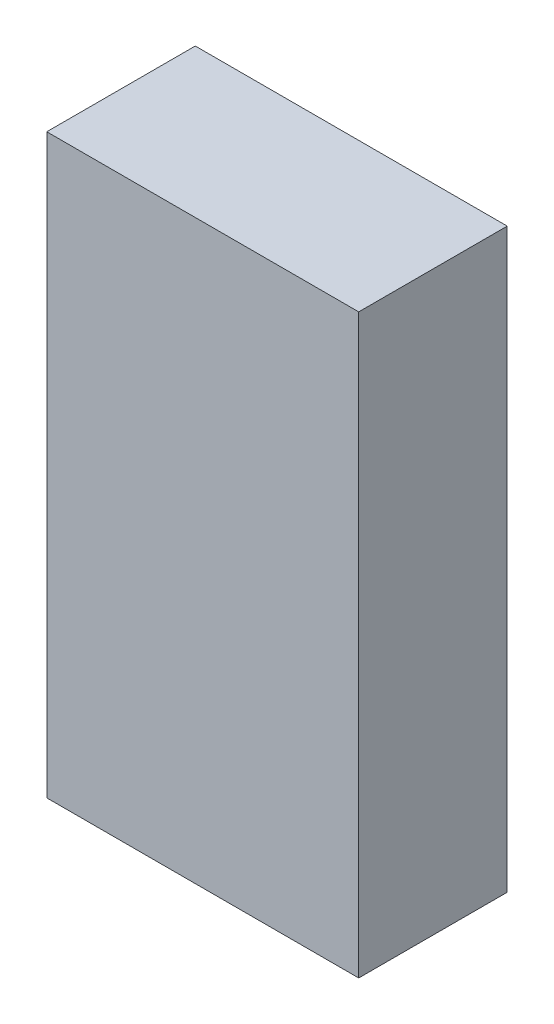
ISO-10303-21;
HEADER;
FILE_DESCRIPTION(('STEP AP214'),'2;1');
FILE_NAME('part.step','',(''),(''),'','','');
FILE_SCHEMA(('AUTOMOTIVE_DESIGN { 1 0 10303 214 1 1 1 1 }'));
ENDSEC;
DATA;
#1=APPLICATION_CONTEXT('core data for automotive mechanical design processes');
#2=APPLICATION_PROTOCOL_DEFINITION('international standard','automotive_design',2000,#1);
#3=PRODUCT_CONTEXT('',#1,'mechanical');
#4=PRODUCT('Part','Part','',(#3));
#5=PRODUCT_RELATED_PRODUCT_CATEGORY('part','',(#4));
#6=PRODUCT_DEFINITION_FORMATION('','',#4);
#7=PRODUCT_DEFINITION_CONTEXT('part definition',#1,'design');
#8=PRODUCT_DEFINITION('design','',#6,#7);
#9=PRODUCT_DEFINITION_SHAPE('','',#8);
#10=(LENGTH_UNIT() NAMED_UNIT(*) SI_UNIT(.MILLI.,.METRE.));
#11=(NAMED_UNIT(*) PLANE_ANGLE_UNIT() SI_UNIT($,.RADIAN.));
#12=(NAMED_UNIT(*) SI_UNIT($,.STERADIAN.) SOLID_ANGLE_UNIT());
#13=UNCERTAINTY_MEASURE_WITH_UNIT(LENGTH_MEASURE(1.E-05),#10,'distance_accuracy_value','');
#14=(GEOMETRIC_REPRESENTATION_CONTEXT(3) GLOBAL_UNCERTAINTY_ASSIGNED_CONTEXT((#13)) GLOBAL_UNIT_ASSIGNED_CONTEXT((#10,
#11,#12)) REPRESENTATION_CONTEXT('',''));
#15=CARTESIAN_POINT('',(0.,0.,0.));
#16=DIRECTION('',(0.,0.,1.));
#17=DIRECTION('',(1.,0.,0.));
#18=AXIS2_PLACEMENT_3D('',#15,#16,#17);
#19=CARTESIAN_POINT('',(33.8593213012928,1341.,-308.522181341687));
#20=DIRECTION('',(-1.,0.,0.));
#21=DIRECTION('',(0.,0.,1.));
#22=AXIS2_PLACEMENT_3D('',#19,#20,#21);
#23=PLANE('',#22);
#24=DIRECTION('',(0.,0.,-1.));
#25=VECTOR('',#24,1.);
#26=CARTESIAN_POINT('',(33.8593213012928,0.,-308.522181341687));
#27=LINE('',#26,#25);
#28=CARTESIAN_POINT('',(33.8593213012928,0.,36.6991154867264));
#29=VERTEX_POINT('',#28);
#30=CARTESIAN_POINT('',(33.8593213012928,0.,-308.522181341687));
#31=VERTEX_POINT('',#30);
#32=EDGE_CURVE('E96',#29,#31,#27,.T.);
#33=ORIENTED_EDGE('',*,*,#32,.T.);
#34=DIRECTION('',(0.,-1.,0.));
#35=VECTOR('',#34,1.);
#36=CARTESIAN_POINT('',(33.8593213012928,1341.,-308.522181341687));
#37=LINE('',#36,#35);
#38=CARTESIAN_POINT('',(33.8593213012928,1341.,-308.522181341687));
#39=VERTEX_POINT('',#38);
#40=EDGE_CURVE('E11',#39,#31,#37,.T.);
#41=ORIENTED_EDGE('',*,*,#40,.F.);
#42=DIRECTION('',(0.,0.,-1.));
#43=VECTOR('',#42,1.);
#44=CARTESIAN_POINT('',(33.8593213012928,1341.,-308.522181341687));
#45=LINE('',#44,#43);
#46=CARTESIAN_POINT('',(33.8593213012928,1341.,36.6991154867264));
#47=VERTEX_POINT('',#46);
#48=EDGE_CURVE('E84',#47,#39,#45,.T.);
#49=ORIENTED_EDGE('',*,*,#48,.F.);
#50=DIRECTION('',(0.,-1.,0.));
#51=VECTOR('',#50,1.);
#52=CARTESIAN_POINT('',(33.8593213012928,1341.,36.6991154867264));
#53=LINE('',#52,#51);
#54=EDGE_CURVE('E92',#47,#29,#53,.T.);
#55=ORIENTED_EDGE('',*,*,#54,.T.);
#56=EDGE_LOOP('',(#33,#41,#49,#55));
#57=FACE_BOUND('',#56,.T.);
#58=ADVANCED_FACE('F33',(#57),#23,.F.);
#59=CARTESIAN_POINT('',(-691.272526414196,1341.,-308.522181341687));
#60=DIRECTION('',(0.,0.,1.));
#61=DIRECTION('',(1.,0.,0.));
#62=AXIS2_PLACEMENT_3D('',#59,#60,#61);
#63=PLANE('',#62);
#64=DIRECTION('',(-1.,0.,0.));
#65=VECTOR('',#64,1.);
#66=CARTESIAN_POINT('',(-691.272526414196,0.,-308.522181341687));
#67=LINE('',#66,#65);
#68=CARTESIAN_POINT('',(-691.272526414196,0.,-308.522181341687));
#69=VERTEX_POINT('',#68);
#70=EDGE_CURVE('E88',#31,#69,#67,.T.);
#71=ORIENTED_EDGE('',*,*,#70,.T.);
#72=DIRECTION('',(0.,-1.,0.));
#73=VECTOR('',#72,1.);
#74=CARTESIAN_POINT('',(-691.272526414196,1341.,-308.522181341687));
#75=LINE('',#74,#73);
#76=CARTESIAN_POINT('',(-691.272526414196,1341.,-308.522181341687));
#77=VERTEX_POINT('',#76);
#78=EDGE_CURVE('E41',#77,#69,#75,.T.);
#79=ORIENTED_EDGE('',*,*,#78,.F.);
#80=DIRECTION('',(-1.,0.,0.));
#81=VECTOR('',#80,1.);
#82=CARTESIAN_POINT('',(-691.272526414196,1341.,-308.522181341687));
#83=LINE('',#82,#81);
#84=EDGE_CURVE('E79',#39,#77,#83,.T.);
#85=ORIENTED_EDGE('',*,*,#84,.F.);
#86=ORIENTED_EDGE('',*,*,#40,.T.);
#87=EDGE_LOOP('',(#71,#79,#85,#86));
#88=FACE_BOUND('',#87,.T.);
#89=ADVANCED_FACE('F87',(#88),#63,.F.);
#90=CARTESIAN_POINT('',(-691.272526414196,1341.,-308.522181341687));
#91=DIRECTION('',(1.,0.,0.));
#92=DIRECTION('',(0.,0.,-1.));
#93=AXIS2_PLACEMENT_3D('',#90,#91,#92);
#94=PLANE('',#93);
#95=DIRECTION('',(0.,0.,1.));
#96=VECTOR('',#95,1.);
#97=CARTESIAN_POINT('',(-691.272526414196,0.,-308.522181341687));
#98=LINE('',#97,#96);
#99=CARTESIAN_POINT('',(-691.272526414196,0.,36.6991154867264));
#100=VERTEX_POINT('',#99);
#101=EDGE_CURVE('E66',#69,#100,#98,.T.);
#102=ORIENTED_EDGE('',*,*,#101,.T.);
#103=DIRECTION('',(0.,-1.,0.));
#104=VECTOR('',#103,1.);
#105=CARTESIAN_POINT('',(-691.272526414196,1341.,36.6991154867264));
#106=LINE('',#105,#104);
#107=CARTESIAN_POINT('',(-691.272526414196,1341.,36.6991154867264));
#108=VERTEX_POINT('',#107);
#109=EDGE_CURVE('E89',#108,#100,#106,.T.);
#110=ORIENTED_EDGE('',*,*,#109,.F.);
#111=DIRECTION('',(0.,0.,1.));
#112=VECTOR('',#111,1.);
#113=CARTESIAN_POINT('',(-691.272526414196,1341.,-308.522181341687));
#114=LINE('',#113,#112);
#115=EDGE_CURVE('E82',#77,#108,#114,.T.);
#116=ORIENTED_EDGE('',*,*,#115,.F.);
#117=ORIENTED_EDGE('',*,*,#78,.T.);
#118=EDGE_LOOP('',(#102,#110,#116,#117));
#119=FACE_BOUND('',#118,.T.);
#120=ADVANCED_FACE('F90',(#119),#94,.F.);
#121=CARTESIAN_POINT('',(-691.272526414196,1341.,36.6991154867264));
#122=DIRECTION('',(0.,0.,-1.));
#123=DIRECTION('',(-1.,0.,0.));
#124=AXIS2_PLACEMENT_3D('',#121,#122,#123);
#125=PLANE('',#124);
#126=DIRECTION('',(1.,0.,0.));
#127=VECTOR('',#126,1.);
#128=CARTESIAN_POINT('',(-691.272526414196,0.,36.6991154867264));
#129=LINE('',#128,#127);
#130=EDGE_CURVE('E72',#100,#29,#129,.T.);
#131=ORIENTED_EDGE('',*,*,#130,.T.);
#132=ORIENTED_EDGE('',*,*,#54,.F.);
#133=DIRECTION('',(1.,0.,0.));
#134=VECTOR('',#133,1.);
#135=CARTESIAN_POINT('',(-691.272526414196,1341.,36.6991154867264));
#136=LINE('',#135,#134);
#137=EDGE_CURVE('E49',#108,#47,#136,.T.);
#138=ORIENTED_EDGE('',*,*,#137,.F.);
#139=ORIENTED_EDGE('',*,*,#109,.T.);
#140=EDGE_LOOP('',(#131,#132,#138,#139));
#141=FACE_BOUND('',#140,.T.);
#142=ADVANCED_FACE('F103',(#141),#125,.F.);
#143=CARTESIAN_POINT('',(0.,1341.,0.));
#144=DIRECTION('',(0.,1.,0.));
#145=DIRECTION('',(0.,0.,1.));
#146=AXIS2_PLACEMENT_3D('',#143,#144,#145);
#147=PLANE('',#146);
#148=ORIENTED_EDGE('',*,*,#48,.T.);
#149=ORIENTED_EDGE('',*,*,#84,.T.);
#150=ORIENTED_EDGE('',*,*,#115,.T.);
#151=ORIENTED_EDGE('',*,*,#137,.T.);
#152=EDGE_LOOP('',(#148,#149,#150,#151));
#153=FACE_BOUND('',#152,.T.);
#154=ADVANCED_FACE('F80',(#153),#147,.T.);
#155=CARTESIAN_POINT('',(0.,0.,0.));
#156=DIRECTION('',(0.,1.,0.));
#157=DIRECTION('',(0.,0.,1.));
#158=AXIS2_PLACEMENT_3D('',#155,#156,#157);
#159=PLANE('',#158);
#160=ORIENTED_EDGE('',*,*,#32,.F.);
#161=ORIENTED_EDGE('',*,*,#130,.F.);
#162=ORIENTED_EDGE('',*,*,#101,.F.);
#163=ORIENTED_EDGE('',*,*,#70,.F.);
#164=EDGE_LOOP('',(#160,#161,#162,#163));
#165=FACE_BOUND('',#164,.T.);
#166=ADVANCED_FACE('F106',(#165),#159,.F.);
#167=CLOSED_SHELL('',(#58,#89,#120,#142,#154,#166));
#168=MANIFOLD_SOLID_BREP('B2',#167);
#169=ADVANCED_BREP_SHAPE_REPRESENTATION('',(#18,#168),#14);
#170=SHAPE_DEFINITION_REPRESENTATION(#9,#169);
ENDSEC;
END-ISO-10303-21;
